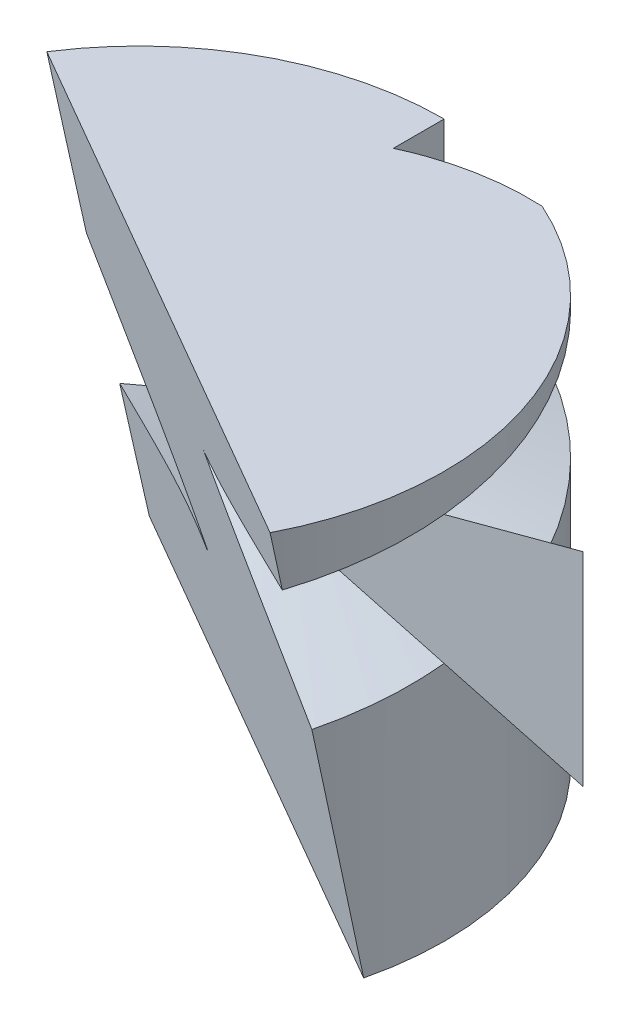
ISO-10303-21;
HEADER;
FILE_DESCRIPTION(('STEP AP214'),'2;1');
FILE_NAME('part.step','',(''),(''),'','','');
FILE_SCHEMA(('AUTOMOTIVE_DESIGN { 1 0 10303 214 1 1 1 1 }'));
ENDSEC;
DATA;
#1=APPLICATION_CONTEXT('core data for automotive mechanical design processes');
#2=APPLICATION_PROTOCOL_DEFINITION('international standard','automotive_design',2000,#1);
#3=PRODUCT_CONTEXT('',#1,'mechanical');
#4=PRODUCT('Part','Part','',(#3));
#5=PRODUCT_RELATED_PRODUCT_CATEGORY('part','',(#4));
#6=PRODUCT_DEFINITION_FORMATION('','',#4);
#7=PRODUCT_DEFINITION_CONTEXT('part definition',#1,'design');
#8=PRODUCT_DEFINITION('design','',#6,#7);
#9=PRODUCT_DEFINITION_SHAPE('','',#8);
#10=(LENGTH_UNIT() NAMED_UNIT(*) SI_UNIT(.MILLI.,.METRE.));
#11=(NAMED_UNIT(*) PLANE_ANGLE_UNIT() SI_UNIT($,.RADIAN.));
#12=(NAMED_UNIT(*) SI_UNIT($,.STERADIAN.) SOLID_ANGLE_UNIT());
#13=UNCERTAINTY_MEASURE_WITH_UNIT(LENGTH_MEASURE(1.E-05),#10,'distance_accuracy_value','');
#14=(GEOMETRIC_REPRESENTATION_CONTEXT(3) GLOBAL_UNCERTAINTY_ASSIGNED_CONTEXT((#13)) GLOBAL_UNIT_ASSIGNED_CONTEXT((#10,
#11,#12)) REPRESENTATION_CONTEXT('',''));
#15=CARTESIAN_POINT('',(0.,0.,0.));
#16=DIRECTION('',(0.,0.,1.));
#17=DIRECTION('',(1.,0.,0.));
#18=AXIS2_PLACEMENT_3D('',#15,#16,#17);
#19=CARTESIAN_POINT('',(0.,0.,0.));
#20=DIRECTION('',(0.,0.,-1.));
#21=DIRECTION('',(-1.,0.,0.));
#22=AXIS2_PLACEMENT_3D('',#19,#20,#21);
#23=PLANE('',#22);
#24=DIRECTION('',(0.,1.,0.));
#25=VECTOR('',#24,1.);
#26=CARTESIAN_POINT('',(17.464,7.99989108922351,0.));
#27=LINE('',#26,#25);
#28=CARTESIAN_POINT('',(17.464,0.,0.));
#29=VERTEX_POINT('',#28);
#30=CARTESIAN_POINT('',(17.464,7.99989108922351,0.));
#31=VERTEX_POINT('',#30);
#32=EDGE_CURVE('E295',#29,#31,#27,.T.);
#33=ORIENTED_EDGE('',*,*,#32,.T.);
#34=DIRECTION('',(-0.965925826289068,-0.258819045102522,0.));
#35=VECTOR('',#34,1.);
#36=CARTESIAN_POINT('',(2.536,3.99994554461169,0.));
#37=LINE('',#36,#35);
#38=CARTESIAN_POINT('',(2.536,3.99994554461169,0.));
#39=VERTEX_POINT('',#38);
#40=EDGE_CURVE('E291',#31,#39,#37,.T.);
#41=ORIENTED_EDGE('',*,*,#40,.T.);
#42=DIRECTION('',(0.96592582628907,-0.258819045102514,0.));
#43=VECTOR('',#42,1.);
#44=CARTESIAN_POINT('',(17.464,0.,0.));
#45=LINE('',#44,#43);
#46=EDGE_CURVE('E239',#39,#29,#45,.T.);
#47=ORIENTED_EDGE('',*,*,#46,.T.);
#48=EDGE_LOOP('',(#33,#41,#47));
#49=FACE_BOUND('',#48,.T.);
#50=ADVANCED_FACE('F286',(#49),#23,.F.);
#51=OPEN_SHELL('',(#50));
#52=SHELL_BASED_SURFACE_MODEL('B186',(#51));
#53=CARTESIAN_POINT('',(0.,8.,0.));
#54=DIRECTION('',(0.,-1.,0.));
#55=DIRECTION('',(0.,0.,-1.));
#56=AXIS2_PLACEMENT_3D('',#53,#54,#55);
#57=CYLINDRICAL_SURFACE('',#56,12.);
#58=CARTESIAN_POINT('',(0.,-8.,0.));
#59=DIRECTION('',(0.,1.,0.));
#60=DIRECTION('',(0.,0.,1.));
#61=AXIS2_PLACEMENT_3D('',#58,#59,#60);
#62=CIRCLE('',#61,12.);
#63=CARTESIAN_POINT('',(11.6625058989147,-8.,2.82594341022257));
#64=VERTEX_POINT('',#63);
#65=CARTESIAN_POINT('',(-8.2785917323673,-8.,-8.68705467513472));
#66=VERTEX_POINT('',#65);
#67=EDGE_CURVE('E526',#64,#66,#62,.T.);
#68=ORIENTED_EDGE('',*,*,#67,.T.);
#69=CARTESIAN_POINT('',(0.,11.191130891887,0.));
#70=DIRECTION('',(0.492403876506105,0.17364817766693,-0.852868531952443));
#71=DIRECTION('',(0.0868240888334653,-0.984807753012208,-0.150383733180435));
#72=AXIS2_PLACEMENT_3D('',#69,#70,#71);
#73=ELLIPSE('',#72,69.1052457977236,12.);
#74=CARTESIAN_POINT('',(-8.85469331209778,-3.47835101993742,-8.09903737173072));
#75=VERTEX_POINT('',#74);
#76=EDGE_CURVE('E492',#66,#75,#73,.T.);
#77=ORIENTED_EDGE('',*,*,#76,.T.);
#78=CARTESIAN_POINT('',(0.,-4.53592561255637,-12.));
#79=CARTESIAN_POINT('',(-2.73892169268178,-4.25021132684209,-12.));
#80=CARTESIAN_POINT('',(-5.20660486941068,-3.9644970411278,-10.811626414829));
#81=CARTESIAN_POINT('',(-7.67428804613958,-3.67878275541352,-9.62325282965807));
#82=CARTESIAN_POINT('',(-9.38197778961635,-3.39306846969923,-7.48187762230482));
#83=CARTESIAN_POINT('',(-11.0896675330931,-3.10735418398494,-5.34050241495156));
#84=CARTESIAN_POINT('',(-11.6991349461819,-2.82163989827066,-2.67025120747579));
#85=CARTESIAN_POINT('',(-12.3086023592707,-2.53592561255637,0.));
#86=CARTESIAN_POINT('',(-11.6991349461819,-2.25021132684209,2.67025120747575));
#87=CARTESIAN_POINT('',(-11.0896675330931,-1.9644970411278,5.34050241495153));
#88=CARTESIAN_POINT('',(-9.38197778961637,-1.67878275541352,7.48187762230479));
#89=CARTESIAN_POINT('',(-7.67428804613961,-1.39306846969923,9.62325282965805));
#90=CARTESIAN_POINT('',(-5.20660486941072,-1.10735418398494,10.811626414829));
#91=CARTESIAN_POINT('',(-2.73892169268182,-0.821639898270659,12.));
#92=CARTESIAN_POINT('',(0.,-0.535925612556373,12.));
#93=CARTESIAN_POINT('',(2.73892169268178,-0.250211326842088,12.));
#94=CARTESIAN_POINT('',(5.20660486941068,0.0355029588721984,10.811626414829));
#95=CARTESIAN_POINT('',(7.67428804613958,0.321217244586484,9.62325282965807));
#96=CARTESIAN_POINT('',(9.38197778961635,0.60693153030077,7.48187762230482));
#97=CARTESIAN_POINT('',(11.0896675330931,0.892645816015056,5.34050241495157));
#98=CARTESIAN_POINT('',(11.6991349461819,1.17836010172934,2.67025120747579));
#99=CARTESIAN_POINT('',(12.3086023592707,1.46407438744363,0.));
#100=CARTESIAN_POINT('',(11.6991349461819,1.74978867315791,-2.67025120747575));
#101=CARTESIAN_POINT('',(11.0896675330931,2.0355029588722,-5.34050241495153));
#102=CARTESIAN_POINT('',(9.38197778961637,2.32121724458648,-7.48187762230479));
#103=CARTESIAN_POINT('',(7.67428804613961,2.60693153030077,-9.62325282965805));
#104=CARTESIAN_POINT('',(5.20660486941072,2.89264581601506,-10.811626414829));
#105=CARTESIAN_POINT('',(2.73892169268182,3.17836010172934,-12.));
#106=CARTESIAN_POINT('',(0.,3.46407438744363,-12.));
#107=(BOUNDED_CURVE() B_SPLINE_CURVE(2,(#78,#79,#80,#81,#82,#83,#84,#85,#86,#87,#88,#89,#90,#91,
#92,#93,#94,#95,#96,#97,#98,#99,#100,#101,#102,#103,#104,#105,#106),.UNSPECIFIED.,.F.,
.F.) B_SPLINE_CURVE_WITH_KNOTS((3,2,2,2,2,2,2,2,2,2,2,2,2,2,3),(0.,0.0714285714285714,
0.142857142857143,0.214285714285714,0.285714285714286,0.357142857142857,0.428571428571429,0.5,
0.571428571428571,0.642857142857143,0.714285714285714,0.785714285714286,0.857142857142857,
0.928571428571429,1.),
.UNSPECIFIED.) CURVE() GEOMETRIC_REPRESENTATION_ITEM() RATIONAL_B_SPLINE_CURVE((1.,
0.974927912181824,1.,0.974927912181824,1.,0.974927912181824,1.,0.974927912181824,1.,
0.974927912181824,1.,0.974927912181824,1.,0.974927912181824,1.,0.974927912181824,1.,
0.974927912181824,1.,0.974927912181824,1.,0.974927912181824,1.,0.974927912181824,1.,
0.974927912181824,1.,0.974927912181824,1.)) REPRESENTATION_ITEM(''));
#108=CARTESIAN_POINT('',(0.,-4.53592561255637,-12.));
#109=VERTEX_POINT('',#108);
#110=EDGE_CURVE('E545',#75,#109,#107,.F.);
#111=ORIENTED_EDGE('',*,*,#110,.T.);
#112=DIRECTION('',(0.,-1.,0.));
#113=VECTOR('',#112,1.);
#114=CARTESIAN_POINT('',(0.,8.,-12.));
#115=LINE('',#114,#113);
#116=CARTESIAN_POINT('',(0.,0.535816701779861,-12.));
#117=VERTEX_POINT('',#116);
#118=EDGE_CURVE('E429',#109,#117,#115,.F.);
#119=ORIENTED_EDGE('',*,*,#118,.T.);
#120=CARTESIAN_POINT('',(0.,0.535816701779861,-12.));
#121=CARTESIAN_POINT('',(-2.73892169268178,0.821530987494147,-12.));
#122=CARTESIAN_POINT('',(-5.20660486941068,1.10724527320843,-10.811626414829));
#123=CARTESIAN_POINT('',(-7.67428804613958,1.39295955892272,-9.62325282965807));
#124=CARTESIAN_POINT('',(-9.38197778961635,1.678673844637,-7.48187762230482));
#125=CARTESIAN_POINT('',(-11.0896675330931,1.96438813035129,-5.34050241495156));
#126=CARTESIAN_POINT('',(-11.6991349461819,2.25010241606558,-2.67025120747579));
#127=CARTESIAN_POINT('',(-12.3086023592707,2.53581670177986,0.));
#128=CARTESIAN_POINT('',(-11.6991349461819,2.82153098749415,2.67025120747575));
#129=CARTESIAN_POINT('',(-11.0896675330931,3.10724527320843,5.34050241495153));
#130=CARTESIAN_POINT('',(-9.38197778961637,3.39295955892272,7.48187762230479));
#131=CARTESIAN_POINT('',(-7.67428804613961,3.678673844637,9.62325282965805));
#132=CARTESIAN_POINT('',(-5.20660486941072,3.96438813035129,10.811626414829));
#133=CARTESIAN_POINT('',(-2.73892169268182,4.25010241606558,12.));
#134=CARTESIAN_POINT('',(0.,4.53581670177986,12.));
#135=CARTESIAN_POINT('',(2.73892169268178,4.82153098749415,12.));
#136=CARTESIAN_POINT('',(5.20660486941068,5.10724527320843,10.811626414829));
#137=CARTESIAN_POINT('',(7.67428804613958,5.39295955892272,9.62325282965807));
#138=CARTESIAN_POINT('',(9.38197778961635,5.678673844637,7.48187762230482));
#139=CARTESIAN_POINT('',(11.0896675330931,5.96438813035129,5.34050241495156));
#140=CARTESIAN_POINT('',(11.6991349461819,6.25010241606558,2.67025120747579));
#141=CARTESIAN_POINT('',(12.3086023592707,6.53581670177986,0.));
#142=CARTESIAN_POINT('',(11.6991349461819,6.82153098749415,-2.67025120747575));
#143=CARTESIAN_POINT('',(11.0896675330931,7.10724527320843,-5.34050241495153));
#144=CARTESIAN_POINT('',(9.38197778961637,7.39295955892272,-7.48187762230479));
#145=CARTESIAN_POINT('',(7.67428804613961,7.678673844637,-9.62325282965805));
#146=CARTESIAN_POINT('',(5.20660486941072,7.96438813035129,-10.811626414829));
#147=CARTESIAN_POINT('',(2.73892169268182,8.25010241606558,-12.));
#148=CARTESIAN_POINT('',(0.,8.53581670177986,-12.));
#149=(BOUNDED_CURVE() B_SPLINE_CURVE(2,(#120,#121,#122,#123,#124,#125,#126,#127,#128,#129,#130,
#131,#132,#133,#134,#135,#136,#137,#138,#139,#140,#141,#142,#143,#144,#145,#146,#147,#148),
.UNSPECIFIED.,.F.,.F.) B_SPLINE_CURVE_WITH_KNOTS((3,2,2,2,2,2,2,2,2,2,2,2,2,2,3),(0.,
0.0714285714285714,0.142857142857143,0.214285714285714,0.285714285714286,0.357142857142857,
0.428571428571429,0.5,0.571428571428571,0.642857142857143,0.714285714285714,0.785714285714286,
0.857142857142857,0.928571428571429,1.),
.UNSPECIFIED.) CURVE() GEOMETRIC_REPRESENTATION_ITEM() RATIONAL_B_SPLINE_CURVE((1.,
0.974927912181824,1.,0.974927912181824,1.,0.974927912181824,1.,0.974927912181824,1.,
0.974927912181824,1.,0.974927912181824,1.,0.974927912181824,1.,0.974927912181824,1.,
0.974927912181824,1.,0.974927912181824,1.,0.974927912181824,1.,0.974927912181824,1.,
0.974927912181824,1.,0.974927912181824,1.)) REPRESENTATION_ITEM(''));
#150=CARTESIAN_POINT('',(-9.45294674325179,1.69063216911371,-7.39200905500293));
#151=VERTEX_POINT('',#150);
#152=EDGE_CURVE('E513',#117,#151,#149,.T.);
#153=ORIENTED_EDGE('',*,*,#152,.T.);
#154=CARTESIAN_POINT('',(-10.0995325851542,8.,-6.48069761379197));
#155=VERTEX_POINT('',#154);
#156=EDGE_CURVE('E351',#151,#155,#73,.T.);
#157=ORIENTED_EDGE('',*,*,#156,.T.);
#158=CARTESIAN_POINT('',(0.,8.,0.));
#159=DIRECTION('',(0.,1.,0.));
#160=DIRECTION('',(0.,0.,1.));
#161=AXIS2_PLACEMENT_3D('',#158,#159,#160);
#162=CIRCLE('',#161,12.);
#163=CARTESIAN_POINT('',(0.,8.,-12.));
#164=VERTEX_POINT('',#163);
#165=EDGE_CURVE('E527',#164,#155,#162,.T.);
#166=ORIENTED_EDGE('',*,*,#165,.F.);
#167=DIRECTION('',(0.,-1.,0.));
#168=VECTOR('',#167,1.);
#169=CARTESIAN_POINT('',(0.,8.,-12.));
#170=LINE('',#169,#168);
#171=CARTESIAN_POINT('',(0.,3.46407438744363,-12.));
#172=VERTEX_POINT('',#171);
#173=EDGE_CURVE('E518',#164,#172,#170,.T.);
#174=ORIENTED_EDGE('',*,*,#173,.T.);
#175=CARTESIAN_POINT('',(11.1742787901442,0.989707575252263,4.37441350584669));
#176=VERTEX_POINT('',#175);
#177=EDGE_CURVE('E432',#172,#176,#107,.F.);
#178=ORIENTED_EDGE('',*,*,#177,.T.);
#179=EDGE_CURVE('E422',#176,#64,#73,.T.);
#180=ORIENTED_EDGE('',*,*,#179,.T.);
#181=EDGE_LOOP('',(#68,#77,#111,#119,#153,#157,#166,#174,#178,#180));
#182=FACE_BOUND('',#181,.T.);
#183=ADVANCED_FACE('F321',(#182),#57,.T.);
#184=CARTESIAN_POINT('',(0.,1.99989108922352,-17.464));
#185=CARTESIAN_POINT('',(-3.98604403674956,2.28560537493781,-17.464));
#186=CARTESIAN_POINT('',(-7.57734561994902,2.57131966065209,-15.7345203090479));
#187=CARTESIAN_POINT('',(-11.1686472031485,2.85703394636638,-14.0050406180957));
#188=CARTESIAN_POINT('',(-13.6539050098217,3.14274823208066,-10.8886258996609));
#189=CARTESIAN_POINT('',(-16.1391628164948,3.42846251779495,-7.77221118122617));
#190=CARTESIAN_POINT('',(-17.0261410583434,3.71417680350924,-3.88610559061309));
#191=CARTESIAN_POINT('',(-17.9131193001919,3.99989108922352,0.));
#192=CARTESIAN_POINT('',(-17.0261410583434,4.28560537493781,3.88610559061306));
#193=CARTESIAN_POINT('',(-16.1391628164949,4.57131966065209,7.77221118122613));
#194=CARTESIAN_POINT('',(-13.6539050098217,4.85703394636638,10.8886258996609));
#195=CARTESIAN_POINT('',(-11.1686472031485,5.14274823208066,14.0050406180957));
#196=CARTESIAN_POINT('',(-7.57734561994905,5.42846251779495,15.7345203090478));
#197=CARTESIAN_POINT('',(-3.9860440367496,5.71417680350924,17.464));
#198=CARTESIAN_POINT('',(0.,5.99989108922352,17.464));
#199=CARTESIAN_POINT('',(3.98604403674956,6.28560537493781,17.464));
#200=CARTESIAN_POINT('',(7.57734561994902,6.57131966065209,15.7345203090479));
#201=CARTESIAN_POINT('',(11.1686472031485,6.85703394636638,14.0050406180957));
#202=CARTESIAN_POINT('',(13.6539050098217,7.14274823208067,10.8886258996609));
#203=CARTESIAN_POINT('',(16.1391628164948,7.42846251779495,7.77221118122617));
#204=CARTESIAN_POINT('',(17.0261410583434,7.71417680350924,3.8861055906131));
#205=CARTESIAN_POINT('',(17.9131193001919,7.99989108922352,0.));
#206=CARTESIAN_POINT('',(17.0261410583434,8.28560537493781,-3.88610559061305));
#207=CARTESIAN_POINT('',(16.1391628164949,8.57131966065209,-7.77221118122613));
#208=CARTESIAN_POINT('',(13.6539050098217,8.85703394636638,-10.8886258996609));
#209=CARTESIAN_POINT('',(11.1686472031485,9.14274823208066,-14.0050406180957));
#210=CARTESIAN_POINT('',(7.57734561994906,9.42846251779495,-15.7345203090478));
#211=CARTESIAN_POINT('',(3.9860440367496,9.71417680350924,-17.464));
#212=CARTESIAN_POINT('',(0.,9.99989108922352,-17.464));
#213=CARTESIAN_POINT('',(0.,-2.00005445538829,-2.536));
#214=CARTESIAN_POINT('',(-0.578825451053401,-1.71434016967401,-2.536));
#215=CARTESIAN_POINT('',(-1.10032916240211,-1.42862588395972,-2.28485704900054));
#216=CARTESIAN_POINT('',(-1.62183287375082,-1.14291159824544,-2.03371409800108));
#217=CARTESIAN_POINT('',(-1.98272463953891,-0.857197312531151,-1.58117013751376));
#218=CARTESIAN_POINT('',(-2.343616405327,-0.571483026816865,-1.12862617702644));
#219=CARTESIAN_POINT('',(-2.4724171852931,-0.28576874110258,-0.564313088513232));
#220=CARTESIAN_POINT('',(-2.6012179652592,-5.4455388294114E-05,0.));
#221=CARTESIAN_POINT('',(-2.47241718529311,0.285659830325992,0.564313088513195));
#222=CARTESIAN_POINT('',(-2.34361640532702,0.571374116040278,1.12862617702641));
#223=CARTESIAN_POINT('',(-1.98272463953894,0.857088401754563,1.58117013751373));
#224=CARTESIAN_POINT('',(-1.62183287375085,1.14280268746885,2.03371409800106));
#225=CARTESIAN_POINT('',(-1.10032916240214,1.42851697318313,2.28485704900053));
#226=CARTESIAN_POINT('',(-0.57882545105344,1.71423125889742,2.536));
#227=CARTESIAN_POINT('',(0.,1.99994554461171,2.536));
#228=CARTESIAN_POINT('',(0.578825451053401,2.28565983032599,2.536));
#229=CARTESIAN_POINT('',(1.10032916240211,2.57137411604028,2.28485704900054));
#230=CARTESIAN_POINT('',(1.62183287375082,2.85708840175456,2.03371409800108));
#231=CARTESIAN_POINT('',(1.98272463953891,3.14280268746885,1.58117013751376));
#232=CARTESIAN_POINT('',(2.343616405327,3.42851697318314,1.12862617702644));
#233=CARTESIAN_POINT('',(2.4724171852931,3.71423125889742,0.564313088513232));
#234=CARTESIAN_POINT('',(2.6012179652592,3.99994554461171,0.));
#235=CARTESIAN_POINT('',(2.47241718529311,4.28565983032599,-0.564313088513194));
#236=CARTESIAN_POINT('',(2.34361640532702,4.57137411604028,-1.12862617702641));
#237=CARTESIAN_POINT('',(1.98272463953894,4.85708840175456,-1.58117013751373));
#238=CARTESIAN_POINT('',(1.62183287375085,5.14280268746885,-2.03371409800106));
#239=CARTESIAN_POINT('',(1.10032916240214,5.42851697318314,-2.28485704900053));
#240=CARTESIAN_POINT('',(0.57882545105344,5.71423125889742,-2.536));
#241=CARTESIAN_POINT('',(0.,5.99994554461171,-2.536));
#242=(BOUNDED_SURFACE() B_SPLINE_SURFACE(1,2,((#184,#185,#186,#187,#188,#189,#190,#191,#192,
#193,#194,#195,#196,#197,#198,#199,#200,#201,#202,#203,#204,#205,#206,#207,#208,#209,#210,#211,
#212),(#213,#214,#215,#216,#217,#218,#219,#220,#221,#222,#223,#224,#225,#226,#227,#228,#229,
#230,#231,#232,#233,#234,#235,#236,#237,#238,#239,#240,#241)),.UNSPECIFIED.,.F.,.F.,
.F.) B_SPLINE_SURFACE_WITH_KNOTS((2,2),(3,2,2,2,2,2,2,2,2,2,2,2,2,2,3),(0.,1.),(0.,
0.0714285714285714,0.142857142857143,0.214285714285714,0.285714285714286,0.357142857142857,
0.428571428571429,0.5,0.571428571428571,0.642857142857143,0.714285714285714,0.785714285714286,
0.857142857142857,0.928571428571429,1.),
.UNSPECIFIED.) GEOMETRIC_REPRESENTATION_ITEM() RATIONAL_B_SPLINE_SURFACE(((1.,0.974927912181824,
1.,0.974927912181824,1.,0.974927912181824,1.,0.974927912181824,1.,0.974927912181824,1.,
0.974927912181824,1.,0.974927912181824,1.,0.974927912181824,1.,0.974927912181824,1.,
0.974927912181824,1.,0.974927912181824,1.,0.974927912181824,1.,0.974927912181824,1.,
0.974927912181824,1.),(1.,0.974927912181824,1.,0.974927912181824,1.,0.974927912181824,1.,
0.974927912181824,1.,0.974927912181824,1.,0.974927912181824,1.,0.974927912181824,1.,
0.974927912181824,1.,0.974927912181824,1.,0.974927912181824,1.,0.974927912181824,1.,
0.974927912181824,1.,0.974927912181824,1.,0.974927912181824,1.))) REPRESENTATION_ITEM('') SURFACE());
#243=CARTESIAN_POINT('',(2.536,3.99994554461171,0.));
#244=CARTESIAN_POINT('',(2.59095525416198,3.9987377063334,0.0314825090407895));
#245=CARTESIAN_POINT('',(2.64582485704329,3.9986006629462,0.0631335863350376));
#246=CARTESIAN_POINT('',(2.75536603741756,4.00019008046666,0.126700829442498));
#247=CARTESIAN_POINT('',(2.81003766207154,4.00191606364119,0.158616925215352));
#248=CARTESIAN_POINT('',(2.97364794340069,4.00946657479334,0.254614685945626));
#249=CARTESIAN_POINT('',(3.08229255369975,4.017662357042,0.319009382041471));
#250=CARTESIAN_POINT('',(3.29813585811529,4.03866766589661,0.447903354907816));
#251=CARTESIAN_POINT('',(3.40533933152626,4.05144866939105,0.512399583561158));
#252=CARTESIAN_POINT('',(3.61910384499054,4.08049247152159,0.641730042206675));
#253=CARTESIAN_POINT('',(3.72566469020583,4.09675627641918,0.7065643645888));
#254=CARTESIAN_POINT('',(3.93804730552415,4.13195121627847,0.836349385501121));
#255=CARTESIAN_POINT('',(4.04386993198098,4.15087839396801,0.901299772727572));
#256=CARTESIAN_POINT('',(4.25505742957136,4.19071516311404,1.03133989109796));
#257=CARTESIAN_POINT('',(4.36042228227798,4.21162483361328,1.09642962769659));
#258=CARTESIAN_POINT('',(4.67590623275495,4.27667013551344,1.29181791098756));
#259=CARTESIAN_POINT('',(4.88545586690527,4.32312927566441,1.42226075537831));
#260=CARTESIAN_POINT('',(5.30345804367024,4.42020159500154,1.68335882060071));
#261=CARTESIAN_POINT('',(5.51191052216324,4.47081501417181,1.81401405327365));
#262=CARTESIAN_POINT('',(5.92757847301052,4.57485471673262,2.07518304561685));
#263=CARTESIAN_POINT('',(6.13479560163483,4.62827504911126,2.20569654988012));
#264=CARTESIAN_POINT('',(6.54872332535699,4.73725566441205,2.46686681546868));
#265=CARTESIAN_POINT('',(6.75543361949974,4.79281699190014,2.59752361571616));
#266=CARTESIAN_POINT('',(7.16845657927412,4.90554240656662,2.85893397494482));
#267=CARTESIAN_POINT('',(7.37476908834404,4.96270702489572,2.98968755167993));
#268=CARTESIAN_POINT('',(7.78705716629487,5.07826003489756,3.25124933884108));
#269=CARTESIAN_POINT('',(7.99303268567516,5.13664859151819,3.38205755427212));
#270=CARTESIAN_POINT('',(8.40467688116987,5.25437337783586,3.64368977993567));
#271=CARTESIAN_POINT('',(8.61034558140473,5.31370952822302,3.77451378794625));
#272=CARTESIAN_POINT('',(8.92751461581931,5.40585274901842,3.97639222287311));
#273=CARTESIAN_POINT('',(9.03909742659998,5.43839167822031,4.04743967282448));
#274=CARTESIAN_POINT('',(9.26218659604009,5.50366557403448,4.18953034724385));
#275=CARTESIAN_POINT('',(9.37369296280068,5.53640051440401,4.26057357104591));
#276=CARTESIAN_POINT('',(9.5966429711763,5.60204707413124,4.40265977697093));
#277=CARTESIAN_POINT('',(9.70808661640342,5.63495868184374,4.4737027588083));
#278=CARTESIAN_POINT('',(9.93097595092826,5.70095784195566,4.61582572582104));
#279=CARTESIAN_POINT('',(10.0424216168798,5.734045469338,4.6869057127844));
#280=CARTESIAN_POINT('',(10.2652752633756,5.80036759247907,4.82907383214611));
#281=CARTESIAN_POINT('',(10.3766832408741,5.83360209798455,4.90016196477059));
#282=CARTESIAN_POINT('',(10.5994730496513,5.90020668679736,5.04235073879172));
#283=CARTESIAN_POINT('',(10.7108548754169,5.93357678769552,5.11345138058705));
#284=CARTESIAN_POINT('',(10.8222182066116,5.96700568709104,5.18455331619662));
#285=B_SPLINE_CURVE_WITH_KNOTS('',3,(#243,#244,#245,#246,#247,#248,#249,#250,#251,#252,#253,
#254,#255,#256,#257,#258,#259,#260,#261,#262,#263,#264,#265,#266,#267,#268,#269,#270,#271,#272,
#273,#274,#275,#276,#277,#278,#279,#280,#281,#282,#283,#284),.UNSPECIFIED.,.F.,.F.,(4,2,2,2,2,2,
2,2,2,2,2,2,2,2,2,2,2,2,2,2,4),(0.,0.190011381781034,0.379974050797438,0.759517342451261,
1.13673943718216,1.51407066745937,1.89084706066158,2.26763848240629,3.02107498349197,
3.77455503972135,4.52649746358584,5.27881151520205,6.03137781383973,6.78404619493042,
7.53665190739396,7.94532672276249,8.35394799480798,8.7625426550447,9.17132811329027,
9.58014111837115,9.9890089694788),.UNSPECIFIED.);
#286=CARTESIAN_POINT('',(2.536,3.99994554461171,0.));
#287=VERTEX_POINT('',#286);
#288=CARTESIAN_POINT('',(10.822218206606,5.96700568708968,5.18455331620811));
#289=VERTEX_POINT('',#288);
#290=EDGE_CURVE('E414',#287,#289,#285,.T.);
#291=CARTESIAN_POINT('',(0.,-2.00005445538829,-2.536));
#292=CARTESIAN_POINT('',(-0.578825451053401,-1.71434016967401,-2.536));
#293=CARTESIAN_POINT('',(-1.10032916240211,-1.42862588395972,-2.28485704900054));
#294=CARTESIAN_POINT('',(-1.62183287375082,-1.14291159824544,-2.03371409800108));
#295=CARTESIAN_POINT('',(-1.98272463953891,-0.857197312531151,-1.58117013751376));
#296=CARTESIAN_POINT('',(-2.343616405327,-0.571483026816865,-1.12862617702644));
#297=CARTESIAN_POINT('',(-2.4724171852931,-0.28576874110258,-0.564313088513232));
#298=CARTESIAN_POINT('',(-2.6012179652592,-5.4455388294114E-05,0.));
#299=CARTESIAN_POINT('',(-2.47241718529311,0.285659830325992,0.564313088513195));
#300=CARTESIAN_POINT('',(-2.34361640532702,0.571374116040278,1.12862617702641));
#301=CARTESIAN_POINT('',(-1.98272463953894,0.857088401754563,1.58117013751373));
#302=CARTESIAN_POINT('',(-1.62183287375085,1.14280268746885,2.03371409800106));
#303=CARTESIAN_POINT('',(-1.10032916240214,1.42851697318313,2.28485704900053));
#304=CARTESIAN_POINT('',(-0.57882545105344,1.71423125889742,2.536));
#305=CARTESIAN_POINT('',(0.,1.99994554461171,2.536));
#306=CARTESIAN_POINT('',(0.578825451053401,2.28565983032599,2.536));
#307=CARTESIAN_POINT('',(1.10032916240211,2.57137411604028,2.28485704900054));
#308=CARTESIAN_POINT('',(1.62183287375082,2.85708840175456,2.03371409800108));
#309=CARTESIAN_POINT('',(1.98272463953891,3.14280268746885,1.58117013751376));
#310=CARTESIAN_POINT('',(2.343616405327,3.42851697318314,1.12862617702644));
#311=CARTESIAN_POINT('',(2.4724171852931,3.71423125889742,0.564313088513232));
#312=CARTESIAN_POINT('',(2.6012179652592,3.99994554461171,0.));
#313=CARTESIAN_POINT('',(2.47241718529311,4.28565983032599,-0.564313088513194));
#314=CARTESIAN_POINT('',(2.34361640532702,4.57137411604028,-1.12862617702641));
#315=CARTESIAN_POINT('',(1.98272463953894,4.85708840175456,-1.58117013751373));
#316=CARTESIAN_POINT('',(1.62183287375085,5.14280268746885,-2.03371409800106));
#317=CARTESIAN_POINT('',(1.10032916240214,5.42851697318314,-2.28485704900053));
#318=CARTESIAN_POINT('',(0.57882545105344,5.71423125889742,-2.536));
#319=CARTESIAN_POINT('',(0.,5.99994554461171,-2.536));
#320=(BOUNDED_CURVE() B_SPLINE_CURVE(2,(#291,#292,#293,#294,#295,#296,#297,#298,#299,#300,#301,
#302,#303,#304,#305,#306,#307,#308,#309,#310,#311,#312,#313,#314,#315,#316,#317,#318,#319),
.UNSPECIFIED.,.F.,.F.) B_SPLINE_CURVE_WITH_KNOTS((3,2,2,2,2,2,2,2,2,2,2,2,2,2,3),(0.,
0.0714285714285714,0.142857142857143,0.214285714285714,0.285714285714286,0.357142857142857,
0.428571428571429,0.5,0.571428571428571,0.642857142857143,0.714285714285714,0.785714285714286,
0.857142857142857,0.928571428571429,1.),
.UNSPECIFIED.) CURVE() GEOMETRIC_REPRESENTATION_ITEM() RATIONAL_B_SPLINE_CURVE((1.,
0.974927912181824,1.,0.974927912181824,1.,0.974927912181824,1.,0.974927912181824,1.,
0.974927912181824,1.,0.974927912181824,1.,0.974927912181824,1.,0.974927912181824,1.,
0.974927912181824,1.,0.974927912181824,1.,0.974927912181824,1.,0.974927912181824,1.,
0.974927912181824,1.,0.974927912181824,1.)) REPRESENTATION_ITEM(''));
#321=CARTESIAN_POINT('',(0.,5.99994554461171,-2.536));
#322=VERTEX_POINT('',#321);
#323=EDGE_CURVE('E400',#287,#322,#320,.T.);
#324=DIRECTION('',(0.,0.258819045102522,-0.965925826289068));
#325=VECTOR('',#324,1.);
#326=CARTESIAN_POINT('',(0.,7.99991831691761,-10.));
#327=LINE('',#326,#325);
#328=CARTESIAN_POINT('',(0.,8.,-10.0003048454136));
#329=VERTEX_POINT('',#328);
#330=EDGE_CURVE('E498',#322,#329,#327,.T.);
#331=CARTESIAN_POINT('',(12.144,8.,-8.18269403910555));
#332=CARTESIAN_POINT('',(12.0048917087798,8.,-8.29173811722363));
#333=CARTESIAN_POINT('',(11.8637786275318,8.,-8.39823026825094));
#334=CARTESIAN_POINT('',(11.5777454112718,8.,-8.6060490028067));
#335=CARTESIAN_POINT('',(11.4328243531288,8.,-8.70737431595196));
#336=CARTESIAN_POINT('',(11.2127498510084,8.,-8.85542915292998));
#337=CARTESIAN_POINT('',(11.1389219966781,8.,-8.90413821762223));
#338=CARTESIAN_POINT('',(10.9902782020307,8.,-9.0000260207024));
#339=CARTESIAN_POINT('',(10.9154622760224,8.,-9.04720478121752));
#340=CARTESIAN_POINT('',(10.7648794478619,8.,-9.1400038145349));
#341=CARTESIAN_POINT('',(10.6891126314983,8.,-9.18562422656763));
#342=CARTESIAN_POINT('',(10.5366521311776,8.,-9.27528845028152));
#343=CARTESIAN_POINT('',(10.4599584364708,8.,-9.31933224365401));
#344=CARTESIAN_POINT('',(10.2276736362509,8.,-9.44954681321637));
#345=CARTESIAN_POINT('',(10.0707106868945,8.,-9.53328790995667));
#346=CARTESIAN_POINT('',(9.75341358384728,8.,-9.69413230166807));
#347=CARTESIAN_POINT('',(9.5930792127436,8.,-9.77123516691609));
#348=CARTESIAN_POINT('',(9.26935290871777,8.,-9.91861871811288));
#349=CARTESIAN_POINT('',(9.10596179840669,8.,-9.98890120889334));
#350=CARTESIAN_POINT('',(8.77637872276012,8.,-10.122507148834));
#351=CARTESIAN_POINT('',(8.61018698465183,8.,-10.1858311594608));
#352=CARTESIAN_POINT('',(8.21909768625453,8.,-10.3254385184168));
#353=CARTESIAN_POINT('',(7.99320247445873,8.,-10.3989466739305));
#354=CARTESIAN_POINT('',(7.53757129483291,8.,-10.5330220077047));
#355=CARTESIAN_POINT('',(7.30783466264439,8.,-10.5935869219927));
#356=CARTESIAN_POINT('',(6.84517990518893,8.,-10.7015254467253));
#357=CARTESIAN_POINT('',(6.61226069715221,8.,-10.7488944442283));
#358=CARTESIAN_POINT('',(6.26140562586402,8.,-10.8098262065656));
#359=CARTESIAN_POINT('',(6.14432493566314,8.,-10.8284363580306));
#360=CARTESIAN_POINT('',(5.9096707368404,8.,-10.8622908130772));
#361=CARTESIAN_POINT('',(5.79209721282448,8.,-10.8775350107104));
#362=CARTESIAN_POINT('',(5.55658915829159,8.,-10.9046405627786));
#363=CARTESIAN_POINT('',(5.43865472200266,8.,-10.9165027347985));
#364=CARTESIAN_POINT('',(5.26153747661722,8.,-10.9317318649335));
#365=CARTESIAN_POINT('',(5.20246314693792,8.,-10.9363808480853));
#366=CARTESIAN_POINT('',(5.0842434481464,8.,-10.9446819349345));
#367=CARTESIAN_POINT('',(5.0250980778641,8.,-10.9483340219797));
#368=CARTESIAN_POINT('',(4.84763517887054,8.,-10.9578245094909));
#369=CARTESIAN_POINT('',(4.72923526012021,8.,-10.9622019510568));
#370=CARTESIAN_POINT('',(4.49235366687742,8.,-10.9670189637722));
#371=CARTESIAN_POINT('',(4.37387198565717,8.,-10.967458158819));
#372=CARTESIAN_POINT('',(3.96375596514341,8.,-10.962132090748));
#373=CARTESIAN_POINT('',(3.67217842417895,8.,-10.9463589691741));
#374=CARTESIAN_POINT('',(3.09130771186575,8.,-10.8906683651148));
#375=CARTESIAN_POINT('',(2.80201506454005,8.,-10.850745498134));
#376=CARTESIAN_POINT('',(2.22829209754076,8.,-10.746864028397));
#377=CARTESIAN_POINT('',(1.94385415129674,8.,-10.6829476321448));
#378=CARTESIAN_POINT('',(1.38153602172768,8.,-10.5312943369555));
#379=CARTESIAN_POINT('',(1.10365208162214,8.,-10.443571463342));
#380=CARTESIAN_POINT('',(0.689204420772244,8.,-10.2929682998532));
#381=CARTESIAN_POINT('',(0.549467544546023,8.,-10.2386748630472));
#382=CARTESIAN_POINT('',(0.272692285912307,8.,-10.124025360623));
#383=CARTESIAN_POINT('',(0.135650980171387,8.,-10.0636763515029));
#384=CARTESIAN_POINT('',(0.,8.,-10.0003048454136));
#385=B_SPLINE_CURVE_WITH_KNOTS('',3,(#331,#332,#333,#334,#335,#336,#337,#338,#339,#340,#341,
#342,#343,#344,#345,#346,#347,#348,#349,#350,#351,#352,#353,#354,#355,#356,#357,#358,#359,#360,
#361,#362,#363,#364,#365,#366,#367,#368,#369,#370,#371,#372,#373,#374,#375,#376,#377,#378,#379,
#380,#381,#382,#383,#384),.UNSPECIFIED.,.F.,.F.,(4,2,2,2,2,2,2,2,2,2,2,2,2,2,2,2,2,2,2,2,2,2,2,
2,2,2,4),(0.,0.530238575151889,1.06060689889662,1.32593840671876,1.59126607630682,
1.85656997788824,2.12187695934408,2.65542045230523,3.18899845804691,3.72243487923625,
4.25582822680121,4.96808983506518,5.68047592707906,6.39311073871485,6.74872228308202,
7.10434501928352,7.45988171273583,7.63764595082655,7.81541315811666,8.17078022241959,
8.52618122393372,9.40109238927399,10.2761986992169,11.1497727875285,12.0228333323817,
12.4724465693981,12.9215418304145),.UNSPECIFIED.);
#386=CARTESIAN_POINT('',(4.89792761004955,8.,-10.9549215025355));
#387=VERTEX_POINT('',#386);
#388=EDGE_CURVE('E474',#387,#329,#385,.T.);
#389=EDGE_CURVE('E418',#289,#387,#149,.T.);
#390=ORIENTED_EDGE('',*,*,#290,.F.);
#391=ORIENTED_EDGE('',*,*,#323,.T.);
#392=ORIENTED_EDGE('',*,*,#330,.T.);
#393=ORIENTED_EDGE('',*,*,#388,.F.);
#394=ORIENTED_EDGE('',*,*,#389,.F.);
#395=EDGE_LOOP('',(#390,#391,#392,#393,#394));
#396=FACE_BOUND('',#395,.T.);
#397=ADVANCED_FACE('F415',(#396),#242,.T.);
#398=CARTESIAN_POINT('',(0.,-2.00005445538829,-2.536));
#399=CARTESIAN_POINT('',(-0.578825451053401,-1.71434016967401,-2.536));
#400=CARTESIAN_POINT('',(-1.10032916240211,-1.42862588395972,-2.28485704900054));
#401=CARTESIAN_POINT('',(-1.62183287375082,-1.14291159824544,-2.03371409800108));
#402=CARTESIAN_POINT('',(-1.98272463953891,-0.857197312531151,-1.58117013751376));
#403=CARTESIAN_POINT('',(-2.343616405327,-0.571483026816865,-1.12862617702644));
#404=CARTESIAN_POINT('',(-2.4724171852931,-0.28576874110258,-0.564313088513232));
#405=CARTESIAN_POINT('',(-2.6012179652592,-5.4455388294114E-05,0.));
#406=CARTESIAN_POINT('',(-2.47241718529311,0.285659830325992,0.564313088513195));
#407=CARTESIAN_POINT('',(-2.34361640532702,0.571374116040278,1.12862617702641));
#408=CARTESIAN_POINT('',(-1.98272463953894,0.857088401754563,1.58117013751373));
#409=CARTESIAN_POINT('',(-1.62183287375085,1.14280268746885,2.03371409800106));
#410=CARTESIAN_POINT('',(-1.10032916240214,1.42851697318313,2.28485704900053));
#411=CARTESIAN_POINT('',(-0.57882545105344,1.71423125889742,2.536));
#412=CARTESIAN_POINT('',(0.,1.99994554461171,2.536));
#413=CARTESIAN_POINT('',(0.578825451053401,2.28565983032599,2.536));
#414=CARTESIAN_POINT('',(1.10032916240211,2.57137411604028,2.28485704900054));
#415=CARTESIAN_POINT('',(1.62183287375082,2.85708840175456,2.03371409800108));
#416=CARTESIAN_POINT('',(1.98272463953891,3.14280268746885,1.58117013751376));
#417=CARTESIAN_POINT('',(2.343616405327,3.42851697318314,1.12862617702644));
#418=CARTESIAN_POINT('',(2.4724171852931,3.71423125889742,0.564313088513232));
#419=CARTESIAN_POINT('',(2.6012179652592,3.99994554461171,0.));
#420=CARTESIAN_POINT('',(2.47241718529311,4.28565983032599,-0.564313088513194));
#421=CARTESIAN_POINT('',(2.34361640532702,4.57137411604028,-1.12862617702641));
#422=CARTESIAN_POINT('',(1.98272463953894,4.85708840175456,-1.58117013751373));
#423=CARTESIAN_POINT('',(1.62183287375085,5.14280268746885,-2.03371409800106));
#424=CARTESIAN_POINT('',(1.10032916240214,5.42851697318314,-2.28485704900053));
#425=CARTESIAN_POINT('',(0.57882545105344,5.71423125889742,-2.536));
#426=CARTESIAN_POINT('',(0.,5.99994554461171,-2.536));
#427=CARTESIAN_POINT('',(0.,-5.99999999999999,-17.464));
#428=CARTESIAN_POINT('',(-3.98604403674956,-5.7142857142857,-17.464));
#429=CARTESIAN_POINT('',(-7.57734561994902,-5.42857142857142,-15.7345203090479));
#430=CARTESIAN_POINT('',(-11.1686472031485,-5.14285714285713,-14.0050406180957));
#431=CARTESIAN_POINT('',(-13.6539050098217,-4.85714285714285,-10.8886258996609));
#432=CARTESIAN_POINT('',(-16.1391628164948,-4.57142857142856,-7.77221118122617));
#433=CARTESIAN_POINT('',(-17.0261410583434,-4.28571428571427,-3.88610559061309));
#434=CARTESIAN_POINT('',(-17.9131193001919,-3.99999999999999,0.));
#435=CARTESIAN_POINT('',(-17.0261410583434,-3.7142857142857,3.88610559061306));
#436=CARTESIAN_POINT('',(-16.1391628164949,-3.42857142857142,7.77221118122613));
#437=CARTESIAN_POINT('',(-13.6539050098217,-3.14285714285713,10.8886258996609));
#438=CARTESIAN_POINT('',(-11.1686472031485,-2.85714285714285,14.0050406180957));
#439=CARTESIAN_POINT('',(-7.57734561994905,-2.57142857142856,15.7345203090478));
#440=CARTESIAN_POINT('',(-3.9860440367496,-2.28571428571427,17.464));
#441=CARTESIAN_POINT('',(0.,-1.99999999999999,17.464));
#442=CARTESIAN_POINT('',(3.98604403674956,-1.7142857142857,17.464));
#443=CARTESIAN_POINT('',(7.57734561994902,-1.42857142857142,15.7345203090479));
#444=CARTESIAN_POINT('',(11.1686472031485,-1.14285714285713,14.0050406180957));
#445=CARTESIAN_POINT('',(13.6539050098217,-0.857142857142845,10.8886258996609));
#446=CARTESIAN_POINT('',(16.1391628164948,-0.57142857142856,7.77221118122617));
#447=CARTESIAN_POINT('',(17.0261410583434,-0.285714285714274,3.8861055906131));
#448=CARTESIAN_POINT('',(17.9131193001919,0.,0.));
#449=CARTESIAN_POINT('',(17.0261410583434,0.285714285714297,-3.88610559061305));
#450=CARTESIAN_POINT('',(16.1391628164949,0.571428571428583,-7.77221118122613));
#451=CARTESIAN_POINT('',(13.6539050098217,0.857142857142869,-10.8886258996609));
#452=CARTESIAN_POINT('',(11.1686472031485,1.14285714285715,-14.0050406180957));
#453=CARTESIAN_POINT('',(7.57734561994906,1.42857142857144,-15.7345203090478));
#454=CARTESIAN_POINT('',(3.9860440367496,1.71428571428573,-17.464));
#455=CARTESIAN_POINT('',(0.,2.00000000000001,-17.464));
#456=(BOUNDED_SURFACE() B_SPLINE_SURFACE(1,2,((#398,#399,#400,#401,#402,#403,#404,#405,#406,
#407,#408,#409,#410,#411,#412,#413,#414,#415,#416,#417,#418,#419,#420,#421,#422,#423,#424,#425,
#426),(#427,#428,#429,#430,#431,#432,#433,#434,#435,#436,#437,#438,#439,#440,#441,#442,#443,
#444,#445,#446,#447,#448,#449,#450,#451,#452,#453,#454,#455)),.UNSPECIFIED.,.F.,.F.,
.F.) B_SPLINE_SURFACE_WITH_KNOTS((2,2),(3,2,2,2,2,2,2,2,2,2,2,2,2,2,3),(0.,1.),(0.,
0.0714285714285714,0.142857142857143,0.214285714285714,0.285714285714286,0.357142857142857,
0.428571428571429,0.5,0.571428571428571,0.642857142857143,0.714285714285714,0.785714285714286,
0.857142857142857,0.928571428571429,1.),
.UNSPECIFIED.) GEOMETRIC_REPRESENTATION_ITEM() RATIONAL_B_SPLINE_SURFACE(((1.,0.974927912181824,
1.,0.974927912181824,1.,0.974927912181824,1.,0.974927912181824,1.,0.974927912181824,1.,
0.974927912181824,1.,0.974927912181824,1.,0.974927912181824,1.,0.974927912181824,1.,
0.974927912181824,1.,0.974927912181824,1.,0.974927912181824,1.,0.974927912181824,1.,
0.974927912181824,1.),(1.,0.974927912181824,1.,0.974927912181824,1.,0.974927912181824,1.,
0.974927912181824,1.,0.974927912181824,1.,0.974927912181824,1.,0.974927912181824,1.,
0.974927912181824,1.,0.974927912181824,1.,0.974927912181824,1.,0.974927912181824,1.,
0.974927912181824,1.,0.974927912181824,1.,0.974927912181824,1.))) REPRESENTATION_ITEM('') SURFACE());
#457=CARTESIAN_POINT('',(0.,-2.04250641361605,-2.69443286498679));
#458=CARTESIAN_POINT('',(-0.0433497452035247,-2.0282925819095,-2.716566846841));
#459=CARTESIAN_POINT('',(-0.0868155725826053,-2.01475593868612,-2.73890572763653));
#460=CARTESIAN_POINT('',(-0.173955172136273,-1.98910495376227,-2.78399313371305));
#461=CARTESIAN_POINT('',(-0.217628949824922,-1.97699064999791,-2.80674166990157));
#462=CARTESIAN_POINT('',(-0.348322150491206,-1.94304015381032,-2.87528493847941));
#463=CARTESIAN_POINT('',(-0.435608730245442,-1.92339968957464,-2.92168097483486));
#464=CARTESIAN_POINT('',(-0.61022235451418,-1.89011594601247,-3.01571746587716));
#465=CARTESIAN_POINT('',(-0.697548115556835,-1.87645127396941,-3.06335282389014));
#466=CARTESIAN_POINT('',(-0.872165900349751,-1.85463383681061,-3.15972631271706));
#467=CARTESIAN_POINT('',(-0.959457884184489,-1.8464761423151,-3.20846341684009));
#468=CARTESIAN_POINT('',(-1.13273899968707,-1.83510825633646,-3.30619275869287));
#469=CARTESIAN_POINT('',(-1.21873056278899,-1.83183636415118,-3.35517383764894));
#470=CARTESIAN_POINT('',(-1.39050702912113,-1.82938042903952,-3.45384898640276));
#471=CARTESIAN_POINT('',(-1.47629150140241,-1.83020186612798,-3.50354392314967));
#472=CARTESIAN_POINT('',(-1.6047243252732,-1.8340256168041,-3.57847318280364));
#473=CARTESIAN_POINT('',(-1.6475211248607,-1.83573400081224,-3.60352976185198));
#474=CARTESIAN_POINT('',(-1.73301326008486,-1.83995708755795,-3.65374851012099));
#475=CARTESIAN_POINT('',(-1.77570859511117,-1.84247179513357,-3.67891067997433));
#476=CARTESIAN_POINT('',(-1.90368574557157,-1.85099010106372,-3.75453269072532));
#477=CARTESIAN_POINT('',(-1.98883195071632,-1.85796691930231,-3.80511238928372));
#478=CARTESIAN_POINT('',(-2.21825608398908,-1.87979729626876,-3.94201524522363));
#479=CARTESIAN_POINT('',(-2.36219558094305,-1.89674564913217,-4.02856951954146));
#480=CARTESIAN_POINT('',(-2.64903178684851,-1.93550836240849,-4.2020667570269));
#481=CARTESIAN_POINT('',(-2.79192911120401,-1.9573195618573,-4.28900943191053));
#482=CARTESIAN_POINT('',(-3.07689781925618,-2.0046836287694,-4.46317974640665));
#483=CARTESIAN_POINT('',(-3.21896929536048,-2.03023606889145,-4.55040735236197));
#484=CARTESIAN_POINT('',(-3.50243073903126,-2.08424715505798,-4.72506081278352));
#485=CARTESIAN_POINT('',(-3.64382070675423,-2.11270580043517,-4.81248666720423));
#486=CARTESIAN_POINT('',(-3.92752373980002,-2.17222254864698,-4.98840058886396));
#487=CARTESIAN_POINT('',(-4.06983077217807,-2.20330494173275,-5.07689011859386));
#488=CARTESIAN_POINT('',(-4.35395383314697,-2.26732540177586,-5.25396352110295));
#489=CARTESIAN_POINT('',(-4.4957698903381,-2.3002633586445,-5.34254738797993));
#490=CARTESIAN_POINT('',(-4.77899900928218,-2.36763646307947,-5.51978728751088));
#491=CARTESIAN_POINT('',(-4.92041207209174,-2.40207160671642,-5.60844331997487));
#492=CARTESIAN_POINT('',(-5.20290047990338,-2.47216378331412,-5.78580918603994));
#493=CARTESIAN_POINT('',(-5.34397582492245,-2.5078208162134,-5.87451901963831));
#494=CARTESIAN_POINT('',(-5.62717090399978,-2.58048448264909,-6.05281645037617));
#495=CARTESIAN_POINT('',(-5.76928793767201,-2.61750067373952,-6.14240443441149));
#496=CARTESIAN_POINT('',(-6.05327460668852,-2.69238832899797,-6.32161170474572));
#497=CARTESIAN_POINT('',(-6.19514424412997,-2.73025978587753,-6.41123099077148));
#498=CARTESIAN_POINT('',(-6.47867397694408,-2.80672216683816,-6.59049507067169));
#499=CARTESIAN_POINT('',(-6.6203340714794,-2.84531309378588,-6.68013986464637));
#500=CARTESIAN_POINT('',(-6.9034747357239,-2.92310530432682,-6.8594500754681));
#501=CARTESIAN_POINT('',(-7.04495530424118,-2.96230659194957,-6.94911549244746));
#502=CARTESIAN_POINT('',(-7.32564399090439,-3.04064014160178,-7.12712027262632));
#503=CARTESIAN_POINT('',(-7.4648544257526,-3.07976465417528,-7.21545939554761));
#504=CARTESIAN_POINT('',(-7.74314270147809,-3.15845050095343,-7.39215002723226));
#505=CARTESIAN_POINT('',(-7.8822205430918,-3.19801183271648,-7.48050153592367));
#506=CARTESIAN_POINT('',(-8.16025827450475,-3.27751304359443,-7.65721352787506));
#507=CARTESIAN_POINT('',(-8.29921816650378,-3.31745291547263,-7.74557401093166));
#508=CARTESIAN_POINT('',(-8.57703121940895,-3.3976643833067,-7.9223008964539));
#509=CARTESIAN_POINT('',(-8.71588438386836,-3.43793596764503,-8.01066729860562));
#510=CARTESIAN_POINT('',(-8.85469331209779,-3.47835101993741,-8.09903737173071));
#511=B_SPLINE_CURVE_WITH_KNOTS('',3,(#457,#458,#459,#460,#461,#462,#463,#464,#465,#466,#467,
#468,#469,#470,#471,#472,#473,#474,#475,#476,#477,#478,#479,#480,#481,#482,#483,#484,#485,#486,
#487,#488,#489,#490,#491,#492,#493,#494,#495,#496,#497,#498,#499,#500,#501,#502,#503,#504,#505,
#506,#507,#508,#509,#510),.UNSPECIFIED.,.F.,.F.,(4,2,2,2,2,2,2,2,2,2,2,2,2,2,2,2,2,2,2,2,2,2,2,
2,2,2,4),(0.,0.152111041308679,0.304226138746604,0.606370010842821,0.907423203647866,
1.20820656054737,1.50515834556114,1.80250778659574,1.9513675397991,2.10022818619532,
2.39804246956478,2.90437134355845,3.41037204656913,3.91631499694336,4.4222578311518,
4.93354684146967,5.44480554941587,5.95606291564227,6.46732025614726,6.98339997527142,
7.49947529808976,8.0155526775948,8.53163346561807,9.03998958705387,9.54834286846838,
10.0566864510331,10.5650123049908),.UNSPECIFIED.);
#512=CARTESIAN_POINT('',(0.,-2.04250641361605,-2.69443286498679));
#513=VERTEX_POINT('',#512);
#514=EDGE_CURVE('E284',#513,#75,#511,.T.);
#515=DIRECTION('',(0.,-0.258819045102514,-0.96592582628907));
#516=VECTOR('',#515,1.);
#517=CARTESIAN_POINT('',(0.,-4.00002722769414,-10.));
#518=LINE('',#517,#516);
#519=EDGE_CURVE('E494',#513,#109,#518,.T.);
#520=ORIENTED_EDGE('',*,*,#514,.F.);
#521=ORIENTED_EDGE('',*,*,#519,.T.);
#522=ORIENTED_EDGE('',*,*,#110,.F.);
#523=EDGE_LOOP('',(#520,#521,#522));
#524=FACE_BOUND('',#523,.T.);
#525=ADVANCED_FACE('F565',(#524),#456,.T.);
#526=CARTESIAN_POINT('',(10.6622150603661,8.,5.50610297819628));
#527=VERTEX_POINT('',#526);
#528=EDGE_CURVE('E529',#527,#387,#162,.T.);
#529=ORIENTED_EDGE('',*,*,#528,.F.);
#530=EDGE_CURVE('E539',#527,#289,#73,.T.);
#531=ORIENTED_EDGE('',*,*,#530,.T.);
#532=ORIENTED_EDGE('',*,*,#389,.T.);
#533=EDGE_LOOP('',(#529,#531,#532));
#534=FACE_BOUND('',#533,.T.);
#535=ADVANCED_FACE('F323',(#534),#57,.T.);
#536=CARTESIAN_POINT('',(0.,8.,0.));
#537=DIRECTION('',(0.,1.,0.));
#538=DIRECTION('',(0.,0.,1.));
#539=AXIS2_PLACEMENT_3D('',#536,#537,#538);
#540=PLANE('',#539);
#541=DIRECTION('',(-0.866025403784438,0.,-0.500000000000001));
#542=VECTOR('',#541,1.);
#543=CARTESIAN_POINT('',(0.281341237605969,8.,-0.487297317797845));
#544=LINE('',#543,#542);
#545=EDGE_CURVE('E343',#527,#155,#544,.T.);
#546=ORIENTED_EDGE('',*,*,#545,.F.);
#547=ORIENTED_EDGE('',*,*,#528,.T.);
#548=ORIENTED_EDGE('',*,*,#388,.T.);
#549=DIRECTION('',(0.,0.,1.));
#550=VECTOR('',#549,1.);
#551=CARTESIAN_POINT('',(0.,8.,0.));
#552=LINE('',#551,#550);
#553=EDGE_CURVE('E543',#164,#329,#552,.T.);
#554=ORIENTED_EDGE('',*,*,#553,.F.);
#555=ORIENTED_EDGE('',*,*,#165,.T.);
#556=EDGE_LOOP('',(#546,#547,#548,#554,#555));
#557=FACE_BOUND('',#556,.T.);
#558=ADVANCED_FACE('F536',(#557),#540,.T.);
#559=CARTESIAN_POINT('',(0.,-8.,0.));
#560=DIRECTION('',(0.,1.,0.));
#561=DIRECTION('',(0.,0.,1.));
#562=AXIS2_PLACEMENT_3D('',#559,#560,#561);
#563=PLANE('',#562);
#564=ORIENTED_EDGE('',*,*,#67,.F.);
#565=DIRECTION('',(-0.866025403784438,0.,-0.500000000000001));
#566=VECTOR('',#565,1.);
#567=CARTESIAN_POINT('',(1.69195708327369,-8.,-2.93055563245607));
#568=LINE('',#567,#566);
#569=EDGE_CURVE('E556',#64,#66,#568,.T.);
#570=ORIENTED_EDGE('',*,*,#569,.T.);
#571=EDGE_LOOP('',(#564,#570));
#572=FACE_BOUND('',#571,.T.);
#573=ADVANCED_FACE('F571',(#572),#563,.F.);
#574=CARTESIAN_POINT('',(0.,-8.16830823869609E-05,-10.));
#575=DIRECTION('',(1.,0.,0.));
#576=DIRECTION('',(0.,0.,-1.));
#577=AXIS2_PLACEMENT_3D('',#574,#575,#576);
#578=PLANE('',#577);
#579=ORIENTED_EDGE('',*,*,#519,.F.);
#580=DIRECTION('',(0.,0.979895488325091,0.199511483278864));
#581=VECTOR('',#580,1.);
#582=CARTESIAN_POINT('',(0.,-1.50962137044567,-2.5859348806132));
#583=LINE('',#582,#581);
#584=CARTESIAN_POINT('',(0.,-1.96199486566218,-2.67804032257309));
#585=VERTEX_POINT('',#584);
#586=EDGE_CURVE('E491',#513,#585,#583,.T.);
#587=ORIENTED_EDGE('',*,*,#586,.T.);
#588=DIRECTION('',(0.,-0.258819045102522,0.965925826289068));
#589=VECTOR('',#588,1.);
#590=CARTESIAN_POINT('',(0.,-8.16830823869609E-05,-10.));
#591=LINE('',#590,#589);
#592=EDGE_CURVE('E410',#117,#585,#591,.T.);
#593=ORIENTED_EDGE('',*,*,#592,.F.);
#594=ORIENTED_EDGE('',*,*,#118,.F.);
#595=EDGE_LOOP('',(#579,#587,#593,#594));
#596=FACE_BOUND('',#595,.T.);
#597=ADVANCED_FACE('F463',(#596),#578,.F.);
#598=CARTESIAN_POINT('',(0.,7.99991831691761,-10.));
#599=DIRECTION('',(-1.,0.,0.));
#600=DIRECTION('',(0.,0.,1.));
#601=AXIS2_PLACEMENT_3D('',#598,#599,#600);
#602=PLANE('',#601);
#603=ORIENTED_EDGE('',*,*,#553,.T.);
#604=ORIENTED_EDGE('',*,*,#330,.F.);
#605=DIRECTION('',(0.,0.258819045102514,0.96592582628907));
#606=VECTOR('',#605,1.);
#607=CARTESIAN_POINT('',(0.,3.99997277230586,-10.));
#608=LINE('',#607,#606);
#609=EDGE_CURVE('E406',#172,#322,#608,.T.);
#610=ORIENTED_EDGE('',*,*,#609,.F.);
#611=ORIENTED_EDGE('',*,*,#173,.F.);
#612=EDGE_LOOP('',(#603,#604,#610,#611));
#613=FACE_BOUND('',#612,.T.);
#614=ADVANCED_FACE('F461',(#613),#602,.F.);
#615=CARTESIAN_POINT('',(-9.45294674325182,1.69063216911372,-7.39200905500295));
#616=CARTESIAN_POINT('',(-9.25361618189327,1.62727041045912,-7.28982626371689));
#617=CARTESIAN_POINT('',(-9.05431191962229,1.56374801302227,-7.18769136305281));
#618=CARTESIAN_POINT('',(-8.65580895712283,1.43630617235265,-6.98356334845184));
#619=CARTESIAN_POINT('',(-8.4566102440865,1.37238680609782,-6.88157021144723));
#620=CARTESIAN_POINT('',(-8.0583225156251,1.24405992146455,-6.67774666152798));
#621=CARTESIAN_POINT('',(-7.8592334892119,1.17965246844938,-6.57591622896106));
#622=CARTESIAN_POINT('',(-7.46117154947432,1.05024527389688,-6.37244299457168));
#623=CARTESIAN_POINT('',(-7.26219862882034,0.985245575348851,-6.27080017976463));
#624=CARTESIAN_POINT('',(-6.86481696666914,0.854661835821367,-6.06795925409726));
#625=CARTESIAN_POINT('',(-6.66640794756118,0.78907939654244,-5.96676065684428));
#626=CARTESIAN_POINT('',(-6.26973440069936,0.657016829377738,-5.76462965822323));
#627=CARTESIAN_POINT('',(-6.07146988363841,0.590536641011302,-5.66369727534287));
#628=CARTESIAN_POINT('',(-5.67511286238243,0.456452618009941,-5.46216060109727));
#629=CARTESIAN_POINT('',(-5.47702038839821,0.388848616572125,-5.36155636113613));
#630=CARTESIAN_POINT('',(-5.08104800445223,0.252218159022336,-5.1607602237936));
#631=CARTESIAN_POINT('',(-4.88316816017214,0.183191350809596,-5.06056843602297));
#632=CARTESIAN_POINT('',(-4.48638573199894,0.0428586798689593,-4.86005840806528));
#633=CARTESIAN_POINT('',(-4.2874855624886,-0.0284596607850035,-4.75974410238916));
#634=CARTESIAN_POINT('',(-3.89017553651914,-0.173441517908567,-4.55987606260159));
#635=CARTESIAN_POINT('',(-3.69176564520808,-0.247104862192381,-4.46032227331052));
#636=CARTESIAN_POINT('',(-3.29567740115477,-0.39745547160469,-4.26225273369687));
#637=CARTESIAN_POINT('',(-3.09799879555222,-0.474141558264826,-4.16373659744346));
#638=CARTESIAN_POINT('',(-2.70365456013784,-0.631427144921439,-3.96808595675481));
#639=CARTESIAN_POINT('',(-2.50698844232439,-0.712024516119037,-3.87095073713791));
#640=CARTESIAN_POINT('',(-2.21271750316719,-0.836746994955822,-3.72644743398772));
#641=CARTESIAN_POINT('',(-2.11464131298738,-0.879007387171349,-3.67842754040809));
#642=CARTESIAN_POINT('',(-1.91885045232228,-0.964905002288449,-3.58287680616023));
#643=CARTESIAN_POINT('',(-1.8211357886033,-1.00854225081505,-3.53534597461593));
#644=CARTESIAN_POINT('',(-1.67486084133681,-1.07509275571923,-3.46444410064024));
#645=CARTESIAN_POINT('',(-1.6261484848218,-1.0974603705659,-3.44087416357287));
#646=CARTESIAN_POINT('',(-1.52887091060868,-1.14270793129579,-3.39392355316242));
#647=CARTESIAN_POINT('',(-1.480305692136,-1.16558787447659,-3.37054287882192));
#648=CARTESIAN_POINT('',(-1.33484617971976,-1.23500474147813,-3.30069540162879));
#649=CARTESIAN_POINT('',(-1.23818211899269,-1.28232137937994,-3.25452027756166));
#650=CARTESIAN_POINT('',(-1.04544424734781,-1.37923700617909,-3.16297550806757));
#651=CARTESIAN_POINT('',(-0.949371305799626,-1.42883872324401,-3.11760692003957));
#652=CARTESIAN_POINT('',(-0.757975014523756,-1.53025988237334,-3.02775406060997));
#653=CARTESIAN_POINT('',(-0.662651723431685,-1.58207949591295,-2.98326985797484));
#654=CARTESIAN_POINT('',(-0.47247652680194,-1.68783676714353,-2.89500485136327));
#655=CARTESIAN_POINT('',(-0.377626537132256,-1.74177966862827,-2.85122622117562));
#656=CARTESIAN_POINT('',(-0.235767055522639,-1.82374896196492,-2.78601295773883));
#657=CARTESIAN_POINT('',(-0.18855324668664,-1.85124583564518,-2.76435254960177));
#658=CARTESIAN_POINT('',(-0.0942185145449194,-1.90647386542282,-2.72113306185218));
#659=CARTESIAN_POINT('',(-0.0470975883942407,-1.93420501420249,-2.69957397910719));
#660=CARTESIAN_POINT('',(0.,-1.96199486566219,-2.67804032257306));
#661=B_SPLINE_CURVE_WITH_KNOTS('',3,(#615,#616,#617,#618,#619,#620,#621,#622,#623,#624,#625,
#626,#627,#628,#629,#630,#631,#632,#633,#634,#635,#636,#637,#638,#639,#640,#641,#642,#643,#644,
#645,#646,#647,#648,#649,#650,#651,#652,#653,#654,#655,#656,#657,#658,#659,#660),.UNSPECIFIED.,
.F.,.F.,(4,2,2,2,2,2,2,2,2,2,2,2,2,2,2,2,2,2,2,2,2,2,4),(0.,0.69835425851413,1.39657708010781,
2.09470799420233,2.79278863051263,3.48933224745991,4.18592302646454,4.88261813741146,
5.57948777953444,6.28118624548133,6.9828333063569,7.6842094723956,8.38520808985716,
8.7364793823489,9.08775721630276,9.26342180862808,9.43908547458099,9.79039153126705,
10.1421284717426,10.4938926558265,10.8465880380555,11.0229099647584,11.1992264041602),.UNSPECIFIED.);
#662=EDGE_CURVE('E482',#151,#585,#661,.T.);
#663=ORIENTED_EDGE('',*,*,#662,.F.);
#664=ORIENTED_EDGE('',*,*,#152,.F.);
#665=ORIENTED_EDGE('',*,*,#592,.T.);
#666=EDGE_LOOP('',(#663,#664,#665));
#667=FACE_BOUND('',#666,.T.);
#668=ADVANCED_FACE('F455',(#667),#242,.T.);
#669=CARTESIAN_POINT('',(11.1742787901442,0.989707575252252,4.3744135058467));
#670=CARTESIAN_POINT('',(10.9328831081089,1.06499391395917,4.25037230826119));
#671=CARTESIAN_POINT('',(10.6915112577498,1.14043014256263,4.12637538821177));
#672=CARTESIAN_POINT('',(10.2088565962645,1.29168204627647,3.87851021209062));
#673=CARTESIAN_POINT('',(9.9675737782619,1.36749767870744,3.75464194335918));
#674=CARTESIAN_POINT('',(9.48509924342427,1.5196002305368,3.50705395949668));
#675=CARTESIAN_POINT('',(9.24390752215873,1.59588712266191,3.38333423625472));
#676=CARTESIAN_POINT('',(8.76177919343479,1.74901254028107,3.13615439503064));
#677=CARTESIAN_POINT('',(8.52084252194963,1.82585067617478,3.01269416075812));
#678=CARTESIAN_POINT('',(8.03908458544973,1.9803023450156,2.76599819677802));
#679=CARTESIAN_POINT('',(7.79826332748634,2.05791592024286,2.64276247974996));
#680=CARTESIAN_POINT('',(7.31676393715617,2.21416253421913,2.39658124702276));
#681=CARTESIAN_POINT('',(7.07608582496724,2.29279569186287,2.27363576718084));
#682=CARTESIAN_POINT('',(6.65472100700548,2.43172415242017,2.05864718580352));
#683=CARTESIAN_POINT('',(6.47398261083949,2.49172280897639,1.96651384216579));
#684=CARTESIAN_POINT('',(6.11268554497732,2.61269944378574,1.78255031467262));
#685=CARTESIAN_POINT('',(5.9321268705101,2.67367739526323,1.69072012261096));
#686=CARTESIAN_POINT('',(5.57127258115285,2.79690439542894,1.50747041757443));
#687=CARTESIAN_POINT('',(5.39097692998193,2.85915324659951,1.41605084343721));
#688=CARTESIAN_POINT('',(5.03074538138354,2.98529461715319,1.23375405791897));
#689=CARTESIAN_POINT('',(4.85080940661817,3.04918672997471,1.14287671910898));
#690=CARTESIAN_POINT('',(4.49127156285189,3.17940344081152,0.961810203348287));
#691=CARTESIAN_POINT('',(4.3116700716542,3.24572992649799,0.871621628861399));
#692=CARTESIAN_POINT('',(3.95320605601816,3.38185408087587,0.692377872273272));
#693=CARTESIAN_POINT('',(3.77434352431312,3.45165171534466,0.60332267900871));
#694=CARTESIAN_POINT('',(3.50691249261853,3.56017645908577,0.471017466077808));
#695=CARTESIAN_POINT('',(3.41789263973359,3.59699815475393,0.427118906226555));
#696=CARTESIAN_POINT('',(3.24025312096283,3.67221122485457,0.339872428820073));
#697=CARTESIAN_POINT('',(3.15163343026077,3.71060250042204,0.296524476807786));
#698=CARTESIAN_POINT('',(2.97475923710114,3.78937365196545,0.21044430302134));
#699=CARTESIAN_POINT('',(2.88650560757692,3.82975678645654,0.167713248685015));
#700=CARTESIAN_POINT('',(2.71068521067173,3.91293001106991,0.0831377679189081));
#701=CARTESIAN_POINT('',(2.62311859790825,3.95572062625335,0.0412935376625775));
#702=CARTESIAN_POINT('',(2.536,3.99994554461171,0.));
#703=B_SPLINE_CURVE_WITH_KNOTS('',3,(#669,#670,#671,#672,#673,#674,#675,#676,#677,#678,#679,
#680,#681,#682,#683,#684,#685,#686,#687,#688,#689,#690,#691,#692,#693,#694,#695,#696,#697,#698,
#699,#700,#701,#702),.UNSPECIFIED.,.F.,.F.,(4,2,2,2,2,2,2,2,2,2,2,2,2,2,2,2,4),(0.,
0.844946994052427,1.68980098527441,2.53460653186288,3.37886450325343,4.22316876104668,
5.06757237579329,5.70223011109359,6.33687052317991,6.97141304195472,7.60580004991186,
8.24068982440368,8.87557334065384,9.19315831424795,9.51072331446402,9.82882626894378,
10.1469988712862),.UNSPECIFIED.);
#704=EDGE_CURVE('E336',#176,#287,#703,.T.);
#705=ORIENTED_EDGE('',*,*,#704,.F.);
#706=ORIENTED_EDGE('',*,*,#177,.F.);
#707=ORIENTED_EDGE('',*,*,#609,.T.);
#708=ORIENTED_EDGE('',*,*,#323,.F.);
#709=EDGE_LOOP('',(#705,#706,#707,#708));
#710=FACE_BOUND('',#709,.T.);
#711=ADVANCED_FACE('F402',(#710),#456,.T.);
#712=CARTESIAN_POINT('',(0.956898047904876,0.337453887265781,-1.65739603663472));
#713=DIRECTION('',(0.492403876506105,0.17364817766693,-0.852868531952443));
#714=DIRECTION('',(-0.866025403784438,0.,-0.500000000000001));
#715=AXIS2_PLACEMENT_3D('',#712,#713,#714);
#716=PLANE('',#715);
#717=ORIENTED_EDGE('',*,*,#586,.F.);
#718=ORIENTED_EDGE('',*,*,#514,.T.);
#719=ORIENTED_EDGE('',*,*,#76,.F.);
#720=ORIENTED_EDGE('',*,*,#569,.F.);
#721=ORIENTED_EDGE('',*,*,#179,.F.);
#722=ORIENTED_EDGE('',*,*,#704,.T.);
#723=ORIENTED_EDGE('',*,*,#290,.T.);
#724=ORIENTED_EDGE('',*,*,#530,.F.);
#725=ORIENTED_EDGE('',*,*,#545,.T.);
#726=ORIENTED_EDGE('',*,*,#156,.F.);
#727=ORIENTED_EDGE('',*,*,#662,.T.);
#728=EDGE_LOOP('',(#717,#718,#719,#720,#721,#722,#723,#724,#725,#726,#727));
#729=FACE_BOUND('',#728,.T.);
#730=ADVANCED_FACE('F426',(#729),#716,.F.);
#731=CLOSED_SHELL('',(#183,#397,#525,#535,#558,#573,#597,#614,#668,#711,#730));
#732=MANIFOLD_SOLID_BREP('B233',#731);
#733=ADVANCED_BREP_SHAPE_REPRESENTATION('',(#18,#732),#14);
#734=MANIFOLD_SURFACE_SHAPE_REPRESENTATION('',(#18,#52),#14);
#735=SHAPE_REPRESENTATION('',(#18),#14);
#736=SHAPE_DEFINITION_REPRESENTATION(#9,#735);
#737=SHAPE_REPRESENTATION_RELATIONSHIP('','',#735,#733);
#738=SHAPE_REPRESENTATION_RELATIONSHIP('','',#735,#734);
ENDSEC;
END-ISO-10303-21;
